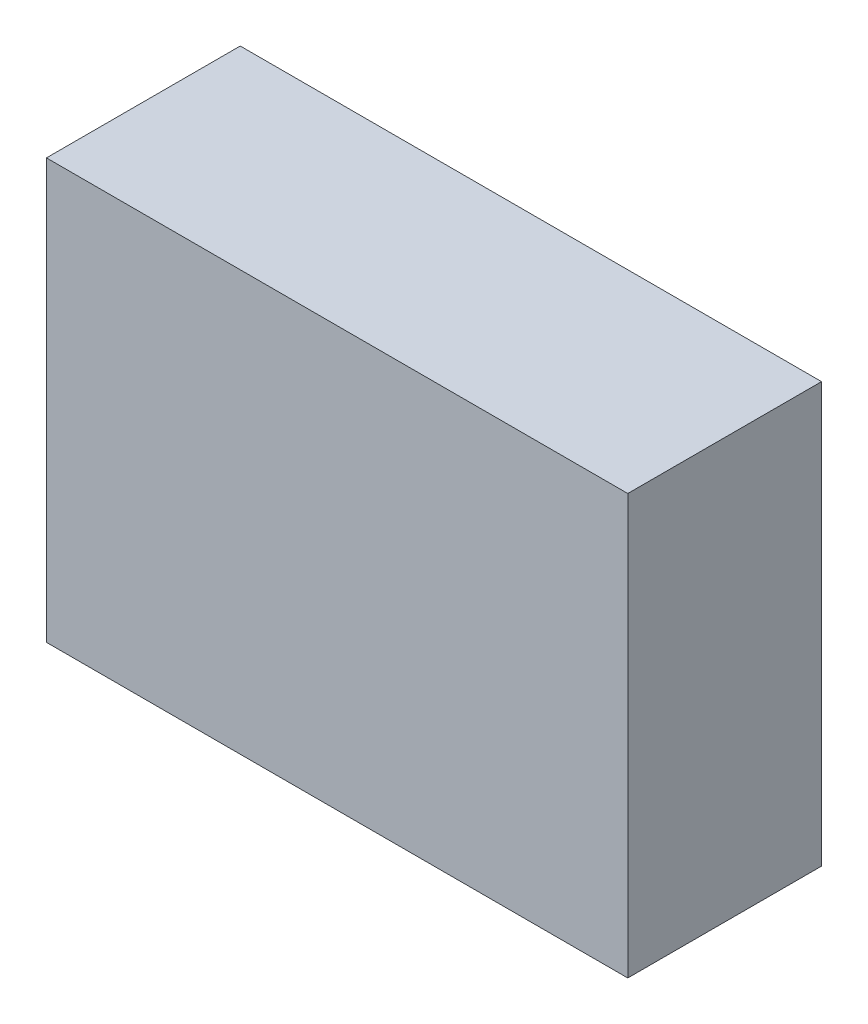
ISO-10303-21;
HEADER;
FILE_DESCRIPTION(('STEP AP214'),'2;1');
FILE_NAME('part.step','',(''),(''),'','','');
FILE_SCHEMA(('AUTOMOTIVE_DESIGN { 1 0 10303 214 1 1 1 1 }'));
ENDSEC;
DATA;
#1=APPLICATION_CONTEXT('core data for automotive mechanical design processes');
#2=APPLICATION_PROTOCOL_DEFINITION('international standard','automotive_design',2000,#1);
#3=PRODUCT_CONTEXT('',#1,'mechanical');
#4=PRODUCT('Part','Part','',(#3));
#5=PRODUCT_RELATED_PRODUCT_CATEGORY('part','',(#4));
#6=PRODUCT_DEFINITION_FORMATION('','',#4);
#7=PRODUCT_DEFINITION_CONTEXT('part definition',#1,'design');
#8=PRODUCT_DEFINITION('design','',#6,#7);
#9=PRODUCT_DEFINITION_SHAPE('','',#8);
#10=(LENGTH_UNIT() NAMED_UNIT(*) SI_UNIT(.MILLI.,.METRE.));
#11=(NAMED_UNIT(*) PLANE_ANGLE_UNIT() SI_UNIT($,.RADIAN.));
#12=(NAMED_UNIT(*) SI_UNIT($,.STERADIAN.) SOLID_ANGLE_UNIT());
#13=UNCERTAINTY_MEASURE_WITH_UNIT(LENGTH_MEASURE(1.E-05),#10,'distance_accuracy_value','');
#14=(GEOMETRIC_REPRESENTATION_CONTEXT(3) GLOBAL_UNCERTAINTY_ASSIGNED_CONTEXT((#13)) GLOBAL_UNIT_ASSIGNED_CONTEXT((#10,
#11,#12)) REPRESENTATION_CONTEXT('',''));
#15=CARTESIAN_POINT('',(0.,0.,0.));
#16=DIRECTION('',(0.,0.,1.));
#17=DIRECTION('',(1.,0.,0.));
#18=AXIS2_PLACEMENT_3D('',#15,#16,#17);
#19=CARTESIAN_POINT('',(-3.81,5.5,-1.27));
#20=DIRECTION('',(1.,0.,0.));
#21=DIRECTION('',(0.,0.,-1.));
#22=AXIS2_PLACEMENT_3D('',#19,#20,#21);
#23=PLANE('',#22);
#24=DIRECTION('',(0.,0.,1.));
#25=VECTOR('',#24,1.);
#26=CARTESIAN_POINT('',(-3.81,0.,-1.27));
#27=LINE('',#26,#25);
#28=CARTESIAN_POINT('',(-3.81,0.,-1.27));
#29=VERTEX_POINT('',#28);
#30=CARTESIAN_POINT('',(-3.81,0.,1.27));
#31=VERTEX_POINT('',#30);
#32=EDGE_CURVE('E100',#29,#31,#27,.T.);
#33=ORIENTED_EDGE('',*,*,#32,.T.);
#34=DIRECTION('',(0.,-1.,0.));
#35=VECTOR('',#34,1.);
#36=CARTESIAN_POINT('',(-3.81,5.5,1.27));
#37=LINE('',#36,#35);
#38=CARTESIAN_POINT('',(-3.81,5.5,1.27));
#39=VERTEX_POINT('',#38);
#40=EDGE_CURVE('E11',#39,#31,#37,.T.);
#41=ORIENTED_EDGE('',*,*,#40,.F.);
#42=DIRECTION('',(0.,0.,1.));
#43=VECTOR('',#42,1.);
#44=CARTESIAN_POINT('',(-3.81,5.5,-1.27));
#45=LINE('',#44,#43);
#46=CARTESIAN_POINT('',(-3.81,5.5,-1.27));
#47=VERTEX_POINT('',#46);
#48=EDGE_CURVE('E88',#47,#39,#45,.T.);
#49=ORIENTED_EDGE('',*,*,#48,.F.);
#50=DIRECTION('',(0.,-1.,0.));
#51=VECTOR('',#50,1.);
#52=CARTESIAN_POINT('',(-3.81,5.5,-1.27));
#53=LINE('',#52,#51);
#54=EDGE_CURVE('E96',#47,#29,#53,.T.);
#55=ORIENTED_EDGE('',*,*,#54,.T.);
#56=EDGE_LOOP('',(#33,#41,#49,#55));
#57=FACE_BOUND('',#56,.T.);
#58=ADVANCED_FACE('F37',(#57),#23,.F.);
#59=CARTESIAN_POINT('',(3.81,5.5,1.27));
#60=DIRECTION('',(0.,0.,-1.));
#61=DIRECTION('',(-1.,0.,0.));
#62=AXIS2_PLACEMENT_3D('',#59,#60,#61);
#63=PLANE('',#62);
#64=DIRECTION('',(1.,0.,0.));
#65=VECTOR('',#64,1.);
#66=CARTESIAN_POINT('',(3.81,0.,1.27));
#67=LINE('',#66,#65);
#68=CARTESIAN_POINT('',(3.81,0.,1.27));
#69=VERTEX_POINT('',#68);
#70=EDGE_CURVE('E92',#31,#69,#67,.T.);
#71=ORIENTED_EDGE('',*,*,#70,.T.);
#72=DIRECTION('',(0.,-1.,0.));
#73=VECTOR('',#72,1.);
#74=CARTESIAN_POINT('',(3.81,5.5,1.27));
#75=LINE('',#74,#73);
#76=CARTESIAN_POINT('',(3.81,5.5,1.27));
#77=VERTEX_POINT('',#76);
#78=EDGE_CURVE('E45',#77,#69,#75,.T.);
#79=ORIENTED_EDGE('',*,*,#78,.F.);
#80=DIRECTION('',(1.,0.,0.));
#81=VECTOR('',#80,1.);
#82=CARTESIAN_POINT('',(3.81,5.5,1.27));
#83=LINE('',#82,#81);
#84=EDGE_CURVE('E83',#39,#77,#83,.T.);
#85=ORIENTED_EDGE('',*,*,#84,.F.);
#86=ORIENTED_EDGE('',*,*,#40,.T.);
#87=EDGE_LOOP('',(#71,#79,#85,#86));
#88=FACE_BOUND('',#87,.T.);
#89=ADVANCED_FACE('F91',(#88),#63,.F.);
#90=CARTESIAN_POINT('',(3.81,5.5,-1.27));
#91=DIRECTION('',(-1.,0.,0.));
#92=DIRECTION('',(0.,0.,1.));
#93=AXIS2_PLACEMENT_3D('',#90,#91,#92);
#94=PLANE('',#93);
#95=DIRECTION('',(0.,0.,-1.));
#96=VECTOR('',#95,1.);
#97=CARTESIAN_POINT('',(3.81,0.,-1.27));
#98=LINE('',#97,#96);
#99=CARTESIAN_POINT('',(3.81,0.,-1.27));
#100=VERTEX_POINT('',#99);
#101=EDGE_CURVE('E70',#69,#100,#98,.T.);
#102=ORIENTED_EDGE('',*,*,#101,.T.);
#103=DIRECTION('',(0.,-1.,0.));
#104=VECTOR('',#103,1.);
#105=CARTESIAN_POINT('',(3.81,5.5,-1.27));
#106=LINE('',#105,#104);
#107=CARTESIAN_POINT('',(3.81,5.5,-1.27));
#108=VERTEX_POINT('',#107);
#109=EDGE_CURVE('E93',#108,#100,#106,.T.);
#110=ORIENTED_EDGE('',*,*,#109,.F.);
#111=DIRECTION('',(0.,0.,-1.));
#112=VECTOR('',#111,1.);
#113=CARTESIAN_POINT('',(3.81,5.5,-1.27));
#114=LINE('',#113,#112);
#115=EDGE_CURVE('E86',#77,#108,#114,.T.);
#116=ORIENTED_EDGE('',*,*,#115,.F.);
#117=ORIENTED_EDGE('',*,*,#78,.T.);
#118=EDGE_LOOP('',(#102,#110,#116,#117));
#119=FACE_BOUND('',#118,.T.);
#120=ADVANCED_FACE('F94',(#119),#94,.F.);
#121=CARTESIAN_POINT('',(3.81,5.5,-1.27));
#122=DIRECTION('',(0.,0.,1.));
#123=DIRECTION('',(1.,0.,0.));
#124=AXIS2_PLACEMENT_3D('',#121,#122,#123);
#125=PLANE('',#124);
#126=DIRECTION('',(-1.,0.,0.));
#127=VECTOR('',#126,1.);
#128=CARTESIAN_POINT('',(3.81,0.,-1.27));
#129=LINE('',#128,#127);
#130=EDGE_CURVE('E76',#100,#29,#129,.T.);
#131=ORIENTED_EDGE('',*,*,#130,.T.);
#132=ORIENTED_EDGE('',*,*,#54,.F.);
#133=DIRECTION('',(-1.,0.,0.));
#134=VECTOR('',#133,1.);
#135=CARTESIAN_POINT('',(3.81,5.5,-1.27));
#136=LINE('',#135,#134);
#137=EDGE_CURVE('E53',#108,#47,#136,.T.);
#138=ORIENTED_EDGE('',*,*,#137,.F.);
#139=ORIENTED_EDGE('',*,*,#109,.T.);
#140=EDGE_LOOP('',(#131,#132,#138,#139));
#141=FACE_BOUND('',#140,.T.);
#142=ADVANCED_FACE('F107',(#141),#125,.F.);
#143=CARTESIAN_POINT('',(0.,5.5,0.));
#144=DIRECTION('',(0.,-1.,0.));
#145=DIRECTION('',(0.,0.,-1.));
#146=AXIS2_PLACEMENT_3D('',#143,#144,#145);
#147=PLANE('',#146);
#148=ORIENTED_EDGE('',*,*,#48,.T.);
#149=ORIENTED_EDGE('',*,*,#84,.T.);
#150=ORIENTED_EDGE('',*,*,#115,.T.);
#151=ORIENTED_EDGE('',*,*,#137,.T.);
#152=EDGE_LOOP('',(#148,#149,#150,#151));
#153=FACE_BOUND('',#152,.T.);
#154=ADVANCED_FACE('F84',(#153),#147,.F.);
#155=CARTESIAN_POINT('',(0.,0.,0.));
#156=DIRECTION('',(0.,-1.,0.));
#157=DIRECTION('',(0.,0.,-1.));
#158=AXIS2_PLACEMENT_3D('',#155,#156,#157);
#159=PLANE('',#158);
#160=ORIENTED_EDGE('',*,*,#32,.F.);
#161=ORIENTED_EDGE('',*,*,#130,.F.);
#162=ORIENTED_EDGE('',*,*,#101,.F.);
#163=ORIENTED_EDGE('',*,*,#70,.F.);
#164=EDGE_LOOP('',(#160,#161,#162,#163));
#165=FACE_BOUND('',#164,.T.);
#166=ADVANCED_FACE('F110',(#165),#159,.T.);
#167=CLOSED_SHELL('',(#58,#89,#120,#142,#154,#166));
#168=MANIFOLD_SOLID_BREP('B2',#167);
#169=ADVANCED_BREP_SHAPE_REPRESENTATION('',(#18,#168),#14);
#170=SHAPE_DEFINITION_REPRESENTATION(#9,#169);
ENDSEC;
END-ISO-10303-21;
